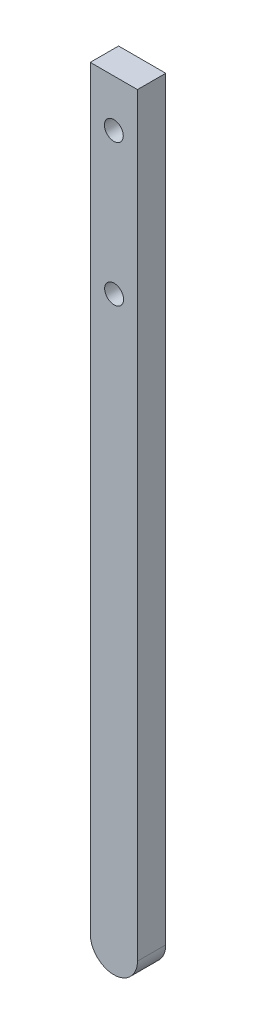
ISO-10303-21;
HEADER;
FILE_DESCRIPTION(('STEP AP214'),'2;1');
FILE_NAME('part.step','',(''),(''),'','','');
FILE_SCHEMA(('AUTOMOTIVE_DESIGN { 1 0 10303 214 1 1 1 1 }'));
ENDSEC;
DATA;
#1=APPLICATION_CONTEXT('core data for automotive mechanical design processes');
#2=APPLICATION_PROTOCOL_DEFINITION('international standard','automotive_design',2000,#1);
#3=PRODUCT_CONTEXT('',#1,'mechanical');
#4=PRODUCT('Part','Part','',(#3));
#5=PRODUCT_RELATED_PRODUCT_CATEGORY('part','',(#4));
#6=PRODUCT_DEFINITION_FORMATION('','',#4);
#7=PRODUCT_DEFINITION_CONTEXT('part definition',#1,'design');
#8=PRODUCT_DEFINITION('design','',#6,#7);
#9=PRODUCT_DEFINITION_SHAPE('','',#8);
#10=(LENGTH_UNIT() NAMED_UNIT(*) SI_UNIT(.MILLI.,.METRE.));
#11=(NAMED_UNIT(*) PLANE_ANGLE_UNIT() SI_UNIT($,.RADIAN.));
#12=(NAMED_UNIT(*) SI_UNIT($,.STERADIAN.) SOLID_ANGLE_UNIT());
#13=UNCERTAINTY_MEASURE_WITH_UNIT(LENGTH_MEASURE(1.E-05),#10,'distance_accuracy_value','');
#14=(GEOMETRIC_REPRESENTATION_CONTEXT(3) GLOBAL_UNCERTAINTY_ASSIGNED_CONTEXT((#13)) GLOBAL_UNIT_ASSIGNED_CONTEXT((#10,
#11,#12)) REPRESENTATION_CONTEXT('',''));
#15=CARTESIAN_POINT('',(0.,0.,0.));
#16=DIRECTION('',(0.,0.,1.));
#17=DIRECTION('',(1.,0.,0.));
#18=AXIS2_PLACEMENT_3D('',#15,#16,#17);
#19=CARTESIAN_POINT('',(0.,-40.,3.));
#20=DIRECTION('',(0.,0.,-1.));
#21=DIRECTION('',(-1.,0.,0.));
#22=AXIS2_PLACEMENT_3D('',#19,#20,#21);
#23=CYLINDRICAL_SURFACE('',#22,2.5);
#24=CARTESIAN_POINT('',(0.,-40.,0.));
#25=DIRECTION('',(0.,0.,1.));
#26=DIRECTION('',(1.,0.,0.));
#27=AXIS2_PLACEMENT_3D('',#24,#25,#26);
#28=CIRCLE('',#27,2.5);
#29=CARTESIAN_POINT('',(-2.5,-40.,0.));
#30=VERTEX_POINT('',#29);
#31=CARTESIAN_POINT('',(2.5,-40.,0.));
#32=VERTEX_POINT('',#31);
#33=EDGE_CURVE('E107',#30,#32,#28,.T.);
#34=ORIENTED_EDGE('',*,*,#33,.T.);
#35=DIRECTION('',(0.,0.,-1.));
#36=VECTOR('',#35,1.);
#37=CARTESIAN_POINT('',(2.5,-40.,3.));
#38=LINE('',#37,#36);
#39=CARTESIAN_POINT('',(2.5,-40.,3.));
#40=VERTEX_POINT('',#39);
#41=EDGE_CURVE('E11',#40,#32,#38,.T.);
#42=ORIENTED_EDGE('',*,*,#41,.F.);
#43=CARTESIAN_POINT('',(0.,-40.,3.));
#44=DIRECTION('',(0.,0.,1.));
#45=DIRECTION('',(1.,0.,0.));
#46=AXIS2_PLACEMENT_3D('',#43,#44,#45);
#47=CIRCLE('',#46,2.5);
#48=CARTESIAN_POINT('',(-2.5,-40.,3.));
#49=VERTEX_POINT('',#48);
#50=EDGE_CURVE('E91',#49,#40,#47,.T.);
#51=ORIENTED_EDGE('',*,*,#50,.F.);
#52=DIRECTION('',(0.,0.,-1.));
#53=VECTOR('',#52,1.);
#54=CARTESIAN_POINT('',(-2.5,-40.,3.));
#55=LINE('',#54,#53);
#56=EDGE_CURVE('E103',#49,#30,#55,.T.);
#57=ORIENTED_EDGE('',*,*,#56,.T.);
#58=EDGE_LOOP('',(#34,#42,#51,#57));
#59=FACE_BOUND('',#58,.T.);
#60=ADVANCED_FACE('F39',(#59),#23,.T.);
#61=CARTESIAN_POINT('',(2.5,40.,3.));
#62=DIRECTION('',(-1.,0.,0.));
#63=DIRECTION('',(0.,-1.,0.));
#64=AXIS2_PLACEMENT_3D('',#61,#62,#63);
#65=PLANE('',#64);
#66=DIRECTION('',(0.,1.,0.));
#67=VECTOR('',#66,1.);
#68=CARTESIAN_POINT('',(2.5,40.,0.));
#69=LINE('',#68,#67);
#70=CARTESIAN_POINT('',(2.5,40.,0.));
#71=VERTEX_POINT('',#70);
#72=EDGE_CURVE('E96',#32,#71,#69,.T.);
#73=ORIENTED_EDGE('',*,*,#72,.T.);
#74=DIRECTION('',(0.,0.,-1.));
#75=VECTOR('',#74,1.);
#76=CARTESIAN_POINT('',(2.5,40.,3.));
#77=LINE('',#76,#75);
#78=CARTESIAN_POINT('',(2.5,40.,3.));
#79=VERTEX_POINT('',#78);
#80=EDGE_CURVE('E48',#79,#71,#77,.T.);
#81=ORIENTED_EDGE('',*,*,#80,.F.);
#82=DIRECTION('',(0.,1.,0.));
#83=VECTOR('',#82,1.);
#84=CARTESIAN_POINT('',(2.5,40.,3.));
#85=LINE('',#84,#83);
#86=EDGE_CURVE('E86',#40,#79,#85,.T.);
#87=ORIENTED_EDGE('',*,*,#86,.F.);
#88=ORIENTED_EDGE('',*,*,#41,.T.);
#89=EDGE_LOOP('',(#73,#81,#87,#88));
#90=FACE_BOUND('',#89,.T.);
#91=ADVANCED_FACE('F95',(#90),#65,.F.);
#92=CARTESIAN_POINT('',(2.5,40.,3.));
#93=DIRECTION('',(0.,-1.,0.));
#94=DIRECTION('',(0.,0.,-1.));
#95=AXIS2_PLACEMENT_3D('',#92,#93,#94);
#96=PLANE('',#95);
#97=DIRECTION('',(-1.,0.,0.));
#98=VECTOR('',#97,1.);
#99=CARTESIAN_POINT('',(2.5,40.,0.));
#100=LINE('',#99,#98);
#101=CARTESIAN_POINT('',(-2.5,40.,0.));
#102=VERTEX_POINT('',#101);
#103=EDGE_CURVE('E73',#71,#102,#100,.T.);
#104=ORIENTED_EDGE('',*,*,#103,.T.);
#105=DIRECTION('',(0.,0.,-1.));
#106=VECTOR('',#105,1.);
#107=CARTESIAN_POINT('',(-2.5,40.,3.));
#108=LINE('',#107,#106);
#109=CARTESIAN_POINT('',(-2.5,40.,3.));
#110=VERTEX_POINT('',#109);
#111=EDGE_CURVE('E98',#110,#102,#108,.T.);
#112=ORIENTED_EDGE('',*,*,#111,.F.);
#113=DIRECTION('',(-1.,0.,0.));
#114=VECTOR('',#113,1.);
#115=CARTESIAN_POINT('',(2.5,40.,3.));
#116=LINE('',#115,#114);
#117=EDGE_CURVE('E89',#79,#110,#116,.T.);
#118=ORIENTED_EDGE('',*,*,#117,.F.);
#119=ORIENTED_EDGE('',*,*,#80,.T.);
#120=EDGE_LOOP('',(#104,#112,#118,#119));
#121=FACE_BOUND('',#120,.T.);
#122=ADVANCED_FACE('F99',(#121),#96,.F.);
#123=CARTESIAN_POINT('',(-2.5,40.,3.));
#124=DIRECTION('',(1.,0.,0.));
#125=DIRECTION('',(0.,1.,0.));
#126=AXIS2_PLACEMENT_3D('',#123,#124,#125);
#127=PLANE('',#126);
#128=DIRECTION('',(0.,-1.,0.));
#129=VECTOR('',#128,1.);
#130=CARTESIAN_POINT('',(-2.5,40.,0.));
#131=LINE('',#130,#129);
#132=EDGE_CURVE('E79',#102,#30,#131,.T.);
#133=ORIENTED_EDGE('',*,*,#132,.T.);
#134=ORIENTED_EDGE('',*,*,#56,.F.);
#135=DIRECTION('',(0.,-1.,0.));
#136=VECTOR('',#135,1.);
#137=CARTESIAN_POINT('',(-2.5,40.,3.));
#138=LINE('',#137,#136);
#139=EDGE_CURVE('E56',#110,#49,#138,.T.);
#140=ORIENTED_EDGE('',*,*,#139,.F.);
#141=ORIENTED_EDGE('',*,*,#111,.T.);
#142=EDGE_LOOP('',(#133,#134,#140,#141));
#143=FACE_BOUND('',#142,.T.);
#144=ADVANCED_FACE('F121',(#143),#127,.F.);
#145=CARTESIAN_POINT('',(0.,-40.,3.));
#146=DIRECTION('',(0.,0.,1.));
#147=DIRECTION('',(1.,0.,0.));
#148=AXIS2_PLACEMENT_3D('',#145,#146,#147);
#149=PLANE('',#148);
#150=CARTESIAN_POINT('',(0.,35.,3.));
#151=DIRECTION('',(0.,0.,1.));
#152=DIRECTION('',(1.,0.,0.));
#153=AXIS2_PLACEMENT_3D('',#150,#151,#152);
#154=CIRCLE('',#153,1.);
#155=CARTESIAN_POINT('',(1.,35.,3.));
#156=VERTEX_POINT('',#155);
#157=EDGE_CURVE('E136',#156,#156,#154,.T.);
#158=ORIENTED_EDGE('',*,*,#157,.F.);
#159=EDGE_LOOP('',(#158));
#160=FACE_BOUND('',#159,.T.);
#161=CARTESIAN_POINT('',(0.0255009123273821,20.,3.));
#162=DIRECTION('',(0.,0.,1.));
#163=DIRECTION('',(1.,0.,0.));
#164=AXIS2_PLACEMENT_3D('',#161,#162,#163);
#165=CIRCLE('',#164,1.);
#166=CARTESIAN_POINT('',(1.02550091232738,20.,3.));
#167=VERTEX_POINT('',#166);
#168=EDGE_CURVE('E128',#167,#167,#165,.T.);
#169=ORIENTED_EDGE('',*,*,#168,.F.);
#170=EDGE_LOOP('',(#169));
#171=FACE_BOUND('',#170,.T.);
#172=ORIENTED_EDGE('',*,*,#50,.T.);
#173=ORIENTED_EDGE('',*,*,#86,.T.);
#174=ORIENTED_EDGE('',*,*,#117,.T.);
#175=ORIENTED_EDGE('',*,*,#139,.T.);
#176=EDGE_LOOP('',(#172,#173,#174,#175));
#177=FACE_BOUND('',#176,.T.);
#178=ADVANCED_FACE('F87',(#160,#171,#177),#149,.T.);
#179=CARTESIAN_POINT('',(0.,-40.,0.));
#180=DIRECTION('',(0.,0.,1.));
#181=DIRECTION('',(1.,0.,0.));
#182=AXIS2_PLACEMENT_3D('',#179,#180,#181);
#183=PLANE('',#182);
#184=CARTESIAN_POINT('',(0.,35.,0.));
#185=DIRECTION('',(0.,0.,1.));
#186=DIRECTION('',(1.,0.,0.));
#187=AXIS2_PLACEMENT_3D('',#184,#185,#186);
#188=CIRCLE('',#187,1.);
#189=CARTESIAN_POINT('',(1.,35.,0.));
#190=VERTEX_POINT('',#189);
#191=EDGE_CURVE('E111',#190,#190,#188,.T.);
#192=ORIENTED_EDGE('',*,*,#191,.T.);
#193=EDGE_LOOP('',(#192));
#194=FACE_BOUND('',#193,.T.);
#195=CARTESIAN_POINT('',(0.0255009123273821,20.,0.));
#196=DIRECTION('',(0.,0.,1.));
#197=DIRECTION('',(1.,0.,0.));
#198=AXIS2_PLACEMENT_3D('',#195,#196,#197);
#199=CIRCLE('',#198,1.);
#200=CARTESIAN_POINT('',(1.02550091232738,20.,0.));
#201=VERTEX_POINT('',#200);
#202=EDGE_CURVE('E132',#201,#201,#199,.T.);
#203=ORIENTED_EDGE('',*,*,#202,.T.);
#204=EDGE_LOOP('',(#203));
#205=FACE_BOUND('',#204,.T.);
#206=ORIENTED_EDGE('',*,*,#33,.F.);
#207=ORIENTED_EDGE('',*,*,#132,.F.);
#208=ORIENTED_EDGE('',*,*,#103,.F.);
#209=ORIENTED_EDGE('',*,*,#72,.F.);
#210=EDGE_LOOP('',(#206,#207,#208,#209));
#211=FACE_BOUND('',#210,.T.);
#212=ADVANCED_FACE('F124',(#194,#205,#211),#183,.F.);
#213=CARTESIAN_POINT('',(0.0255009123273821,20.,0.));
#214=DIRECTION('',(0.,0.,1.));
#215=DIRECTION('',(1.,0.,0.));
#216=AXIS2_PLACEMENT_3D('',#213,#214,#215);
#217=CYLINDRICAL_SURFACE('',#216,1.);
#218=ORIENTED_EDGE('',*,*,#202,.F.);
#219=EDGE_LOOP('',(#218));
#220=FACE_BOUND('',#219,.T.);
#221=ORIENTED_EDGE('',*,*,#168,.T.);
#222=EDGE_LOOP('',(#221));
#223=FACE_BOUND('',#222,.T.);
#224=ADVANCED_FACE('F149',(#220,#223),#217,.F.);
#225=CARTESIAN_POINT('',(0.,35.,0.));
#226=DIRECTION('',(0.,0.,1.));
#227=DIRECTION('',(1.,0.,0.));
#228=AXIS2_PLACEMENT_3D('',#225,#226,#227);
#229=CYLINDRICAL_SURFACE('',#228,1.);
#230=ORIENTED_EDGE('',*,*,#191,.F.);
#231=EDGE_LOOP('',(#230));
#232=FACE_BOUND('',#231,.T.);
#233=ORIENTED_EDGE('',*,*,#157,.T.);
#234=EDGE_LOOP('',(#233));
#235=FACE_BOUND('',#234,.T.);
#236=ADVANCED_FACE('F146',(#232,#235),#229,.F.);
#237=CLOSED_SHELL('',(#60,#91,#122,#144,#178,#212,#224,#236));
#238=MANIFOLD_SOLID_BREP('B2',#237);
#239=ADVANCED_BREP_SHAPE_REPRESENTATION('',(#18,#238),#14);
#240=SHAPE_DEFINITION_REPRESENTATION(#9,#239);
ENDSEC;
END-ISO-10303-21;
